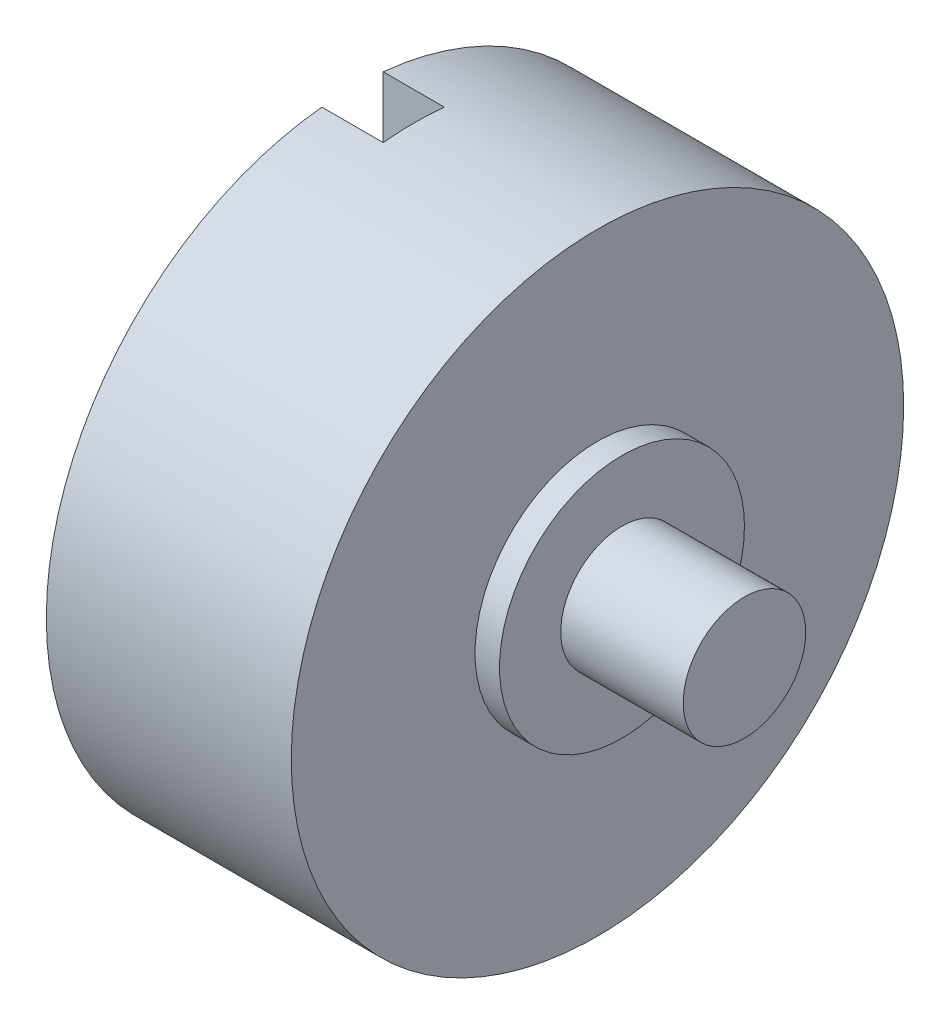
ISO-10303-21;
HEADER;
FILE_DESCRIPTION(('STEP AP214'),'2;1');
FILE_NAME('part.step','',(''),(''),'','','');
FILE_SCHEMA(('AUTOMOTIVE_DESIGN { 1 0 10303 214 1 1 1 1 }'));
ENDSEC;
DATA;
#1=APPLICATION_CONTEXT('core data for automotive mechanical design processes');
#2=APPLICATION_PROTOCOL_DEFINITION('international standard','automotive_design',2000,#1);
#3=PRODUCT_CONTEXT('',#1,'mechanical');
#4=PRODUCT('Part','Part','',(#3));
#5=PRODUCT_RELATED_PRODUCT_CATEGORY('part','',(#4));
#6=PRODUCT_DEFINITION_FORMATION('','',#4);
#7=PRODUCT_DEFINITION_CONTEXT('part definition',#1,'design');
#8=PRODUCT_DEFINITION('design','',#6,#7);
#9=PRODUCT_DEFINITION_SHAPE('','',#8);
#10=(LENGTH_UNIT() NAMED_UNIT(*) SI_UNIT(.MILLI.,.METRE.));
#11=(NAMED_UNIT(*) PLANE_ANGLE_UNIT() SI_UNIT($,.RADIAN.));
#12=(NAMED_UNIT(*) SI_UNIT($,.STERADIAN.) SOLID_ANGLE_UNIT());
#13=UNCERTAINTY_MEASURE_WITH_UNIT(LENGTH_MEASURE(1.E-05),#10,'distance_accuracy_value','');
#14=(GEOMETRIC_REPRESENTATION_CONTEXT(3) GLOBAL_UNCERTAINTY_ASSIGNED_CONTEXT((#13)) GLOBAL_UNIT_ASSIGNED_CONTEXT((#10,
#11,#12)) REPRESENTATION_CONTEXT('',''));
#15=CARTESIAN_POINT('',(0.,0.,0.));
#16=DIRECTION('',(0.,0.,1.));
#17=DIRECTION('',(1.,0.,0.));
#18=AXIS2_PLACEMENT_3D('',#15,#16,#17);
#19=CARTESIAN_POINT('',(10.,0.,0.));
#20=DIRECTION('',(1.,0.,0.));
#21=DIRECTION('',(0.,0.,-1.));
#22=AXIS2_PLACEMENT_3D('',#19,#20,#21);
#23=PLANE('',#22);
#24=CARTESIAN_POINT('',(10.,0.,0.));
#25=DIRECTION('',(1.,0.,0.));
#26=DIRECTION('',(0.,0.,-1.));
#27=AXIS2_PLACEMENT_3D('',#24,#25,#26);
#28=CIRCLE('',#27,25.);
#29=CARTESIAN_POINT('',(10.,0.,-25.));
#30=VERTEX_POINT('',#29);
#31=EDGE_CURVE('E11',#30,#30,#28,.T.);
#32=ORIENTED_EDGE('',*,*,#31,.T.);
#33=EDGE_LOOP('',(#32));
#34=FACE_BOUND('',#33,.T.);
#35=CARTESIAN_POINT('',(10.,0.,0.));
#36=DIRECTION('',(1.,0.,0.));
#37=DIRECTION('',(0.,0.,-1.));
#38=AXIS2_PLACEMENT_3D('',#35,#36,#37);
#39=CIRCLE('',#38,10.);
#40=CARTESIAN_POINT('',(10.,0.,-10.));
#41=VERTEX_POINT('',#40);
#42=EDGE_CURVE('E160',#41,#41,#39,.T.);
#43=ORIENTED_EDGE('',*,*,#42,.F.);
#44=EDGE_LOOP('',(#43));
#45=FACE_BOUND('',#44,.T.);
#46=ADVANCED_FACE('F35',(#34,#45),#23,.T.);
#47=CARTESIAN_POINT('',(-10.,0.,0.));
#48=DIRECTION('',(1.,0.,0.));
#49=DIRECTION('',(0.,0.,-1.));
#50=AXIS2_PLACEMENT_3D('',#47,#48,#49);
#51=PLANE('',#50);
#52=CARTESIAN_POINT('',(-10.,0.,0.));
#53=DIRECTION('',(1.,0.,0.));
#54=DIRECTION('',(0.,0.,-1.));
#55=AXIS2_PLACEMENT_3D('',#52,#53,#54);
#56=CIRCLE('',#55,25.);
#57=CARTESIAN_POINT('',(-10.,-24.8746859276655,-2.5));
#58=VERTEX_POINT('',#57);
#59=CARTESIAN_POINT('',(-10.,24.8746859276655,-2.5));
#60=VERTEX_POINT('',#59);
#61=EDGE_CURVE('E112',#58,#60,#56,.T.);
#62=ORIENTED_EDGE('',*,*,#61,.F.);
#63=DIRECTION('',(0.,-1.,0.));
#64=VECTOR('',#63,1.);
#65=CARTESIAN_POINT('',(-10.,24.8746859276655,-2.5));
#66=LINE('',#65,#64);
#67=EDGE_CURVE('E75',#60,#58,#66,.T.);
#68=ORIENTED_EDGE('',*,*,#67,.F.);
#69=EDGE_LOOP('',(#62,#68));
#70=FACE_BOUND('',#69,.T.);
#71=ADVANCED_FACE('F118',(#70),#51,.F.);
#72=CARTESIAN_POINT('',(10.,0.,0.));
#73=DIRECTION('',(-1.,0.,0.));
#74=DIRECTION('',(0.,0.,1.));
#75=AXIS2_PLACEMENT_3D('',#72,#73,#74);
#76=CYLINDRICAL_SURFACE('',#75,25.);
#77=ORIENTED_EDGE('',*,*,#61,.T.);
#78=DIRECTION('',(-1.,0.,0.));
#79=VECTOR('',#78,1.);
#80=CARTESIAN_POINT('',(-5.,24.8746859276655,-2.5));
#81=LINE('',#80,#79);
#82=CARTESIAN_POINT('',(-5.,24.8746859276655,-2.5));
#83=VERTEX_POINT('',#82);
#84=EDGE_CURVE('E89',#83,#60,#81,.T.);
#85=ORIENTED_EDGE('',*,*,#84,.F.);
#86=CARTESIAN_POINT('',(-5.,0.,0.));
#87=DIRECTION('',(-1.,0.,0.));
#88=DIRECTION('',(0.,0.,1.));
#89=AXIS2_PLACEMENT_3D('',#86,#87,#88);
#90=CIRCLE('',#89,25.);
#91=CARTESIAN_POINT('',(-5.,24.8746859276655,2.5));
#92=VERTEX_POINT('',#91);
#93=EDGE_CURVE('E93',#92,#83,#90,.T.);
#94=ORIENTED_EDGE('',*,*,#93,.F.);
#95=DIRECTION('',(-1.,0.,0.));
#96=VECTOR('',#95,1.);
#97=CARTESIAN_POINT('',(-5.,24.8746859276655,2.5));
#98=LINE('',#97,#96);
#99=CARTESIAN_POINT('',(-10.,24.8746859276655,2.5));
#100=VERTEX_POINT('',#99);
#101=EDGE_CURVE('E82',#92,#100,#98,.T.);
#102=ORIENTED_EDGE('',*,*,#101,.T.);
#103=CARTESIAN_POINT('',(-10.,-24.8746859276655,2.5));
#104=VERTEX_POINT('',#103);
#105=EDGE_CURVE('E44',#100,#104,#56,.T.);
#106=ORIENTED_EDGE('',*,*,#105,.T.);
#107=DIRECTION('',(-1.,0.,0.));
#108=VECTOR('',#107,1.);
#109=CARTESIAN_POINT('',(-5.,-24.8746859276655,2.5));
#110=LINE('',#109,#108);
#111=CARTESIAN_POINT('',(-5.,-24.8746859276655,2.5));
#112=VERTEX_POINT('',#111);
#113=EDGE_CURVE('E52',#112,#104,#110,.T.);
#114=ORIENTED_EDGE('',*,*,#113,.F.);
#115=CARTESIAN_POINT('',(-5.,0.,0.));
#116=DIRECTION('',(-1.,0.,0.));
#117=DIRECTION('',(0.,0.,1.));
#118=AXIS2_PLACEMENT_3D('',#115,#116,#117);
#119=CIRCLE('',#118,25.);
#120=CARTESIAN_POINT('',(-5.,-24.8746859276655,-2.5));
#121=VERTEX_POINT('',#120);
#122=EDGE_CURVE('E95',#121,#112,#119,.T.);
#123=ORIENTED_EDGE('',*,*,#122,.F.);
#124=DIRECTION('',(-1.,0.,0.));
#125=VECTOR('',#124,1.);
#126=CARTESIAN_POINT('',(-5.,-24.8746859276655,-2.5));
#127=LINE('',#126,#125);
#128=EDGE_CURVE('E61',#121,#58,#127,.T.);
#129=ORIENTED_EDGE('',*,*,#128,.T.);
#130=EDGE_LOOP('',(#77,#85,#94,#102,#106,#114,#123,#129));
#131=FACE_BOUND('',#130,.T.);
#132=ORIENTED_EDGE('',*,*,#31,.F.);
#133=EDGE_LOOP('',(#132));
#134=FACE_BOUND('',#133,.T.);
#135=ADVANCED_FACE('F37',(#131,#134),#76,.T.);
#136=ORIENTED_EDGE('',*,*,#105,.F.);
#137=DIRECTION('',(0.,1.,0.));
#138=VECTOR('',#137,1.);
#139=CARTESIAN_POINT('',(-10.,24.8746859276655,2.5));
#140=LINE('',#139,#138);
#141=EDGE_CURVE('E84',#104,#100,#140,.T.);
#142=ORIENTED_EDGE('',*,*,#141,.F.);
#143=EDGE_LOOP('',(#136,#142));
#144=FACE_BOUND('',#143,.T.);
#145=ADVANCED_FACE('F115',(#144),#51,.F.);
#146=CARTESIAN_POINT('',(-5.,24.8746859276655,-2.5));
#147=DIRECTION('',(0.,0.,-1.));
#148=DIRECTION('',(0.,1.,0.));
#149=AXIS2_PLACEMENT_3D('',#146,#147,#148);
#150=PLANE('',#149);
#151=ORIENTED_EDGE('',*,*,#67,.T.);
#152=ORIENTED_EDGE('',*,*,#128,.F.);
#153=DIRECTION('',(0.,-1.,0.));
#154=VECTOR('',#153,1.);
#155=CARTESIAN_POINT('',(-5.,24.8746859276655,-2.5));
#156=LINE('',#155,#154);
#157=EDGE_CURVE('E100',#83,#121,#156,.T.);
#158=ORIENTED_EDGE('',*,*,#157,.F.);
#159=ORIENTED_EDGE('',*,*,#84,.T.);
#160=EDGE_LOOP('',(#151,#152,#158,#159));
#161=FACE_BOUND('',#160,.T.);
#162=ADVANCED_FACE('F117',(#161),#150,.F.);
#163=CARTESIAN_POINT('',(-5.,24.8746859276655,2.5));
#164=DIRECTION('',(0.,0.,1.));
#165=DIRECTION('',(0.,-1.,0.));
#166=AXIS2_PLACEMENT_3D('',#163,#164,#165);
#167=PLANE('',#166);
#168=ORIENTED_EDGE('',*,*,#141,.T.);
#169=ORIENTED_EDGE('',*,*,#101,.F.);
#170=DIRECTION('',(0.,1.,0.));
#171=VECTOR('',#170,1.);
#172=CARTESIAN_POINT('',(-5.,24.8746859276655,2.5));
#173=LINE('',#172,#171);
#174=EDGE_CURVE('E79',#112,#92,#173,.T.);
#175=ORIENTED_EDGE('',*,*,#174,.F.);
#176=ORIENTED_EDGE('',*,*,#113,.T.);
#177=EDGE_LOOP('',(#168,#169,#175,#176));
#178=FACE_BOUND('',#177,.T.);
#179=ADVANCED_FACE('F83',(#178),#167,.F.);
#180=CARTESIAN_POINT('',(-5.,0.,0.));
#181=DIRECTION('',(-1.,0.,0.));
#182=DIRECTION('',(0.,0.,1.));
#183=AXIS2_PLACEMENT_3D('',#180,#181,#182);
#184=PLANE('',#183);
#185=ORIENTED_EDGE('',*,*,#122,.T.);
#186=ORIENTED_EDGE('',*,*,#174,.T.);
#187=ORIENTED_EDGE('',*,*,#93,.T.);
#188=ORIENTED_EDGE('',*,*,#157,.T.);
#189=EDGE_LOOP('',(#185,#186,#187,#188));
#190=FACE_BOUND('',#189,.T.);
#191=ADVANCED_FACE('F92',(#190),#184,.T.);
#192=CARTESIAN_POINT('',(12.,0.,0.));
#193=DIRECTION('',(1.,0.,0.));
#194=DIRECTION('',(0.,0.,-1.));
#195=AXIS2_PLACEMENT_3D('',#192,#193,#194);
#196=PLANE('',#195);
#197=CARTESIAN_POINT('',(12.,0.,0.));
#198=DIRECTION('',(1.,0.,0.));
#199=DIRECTION('',(0.,0.,-1.));
#200=AXIS2_PLACEMENT_3D('',#197,#198,#199);
#201=CIRCLE('',#200,10.);
#202=CARTESIAN_POINT('',(12.,0.,-10.));
#203=VERTEX_POINT('',#202);
#204=EDGE_CURVE('E157',#203,#203,#201,.T.);
#205=ORIENTED_EDGE('',*,*,#204,.T.);
#206=EDGE_LOOP('',(#205));
#207=FACE_BOUND('',#206,.T.);
#208=CARTESIAN_POINT('',(12.,0.,0.));
#209=DIRECTION('',(1.,0.,0.));
#210=DIRECTION('',(0.,0.,-1.));
#211=AXIS2_PLACEMENT_3D('',#208,#209,#210);
#212=CIRCLE('',#211,5.);
#213=CARTESIAN_POINT('',(12.,0.,-5.));
#214=VERTEX_POINT('',#213);
#215=EDGE_CURVE('E39',#214,#214,#212,.T.);
#216=ORIENTED_EDGE('',*,*,#215,.F.);
#217=EDGE_LOOP('',(#216));
#218=FACE_BOUND('',#217,.T.);
#219=ADVANCED_FACE('F146',(#207,#218),#196,.T.);
#220=CARTESIAN_POINT('',(12.,0.,0.));
#221=DIRECTION('',(-1.,0.,0.));
#222=DIRECTION('',(0.,0.,1.));
#223=AXIS2_PLACEMENT_3D('',#220,#221,#222);
#224=CYLINDRICAL_SURFACE('',#223,10.);
#225=ORIENTED_EDGE('',*,*,#204,.F.);
#226=EDGE_LOOP('',(#225));
#227=FACE_BOUND('',#226,.T.);
#228=ORIENTED_EDGE('',*,*,#42,.T.);
#229=EDGE_LOOP('',(#228));
#230=FACE_BOUND('',#229,.T.);
#231=ADVANCED_FACE('F140',(#227,#230),#224,.T.);
#232=CARTESIAN_POINT('',(22.,0.,0.));
#233=DIRECTION('',(1.,0.,0.));
#234=DIRECTION('',(0.,0.,-1.));
#235=AXIS2_PLACEMENT_3D('',#232,#233,#234);
#236=PLANE('',#235);
#237=CARTESIAN_POINT('',(22.,0.,0.));
#238=DIRECTION('',(1.,0.,0.));
#239=DIRECTION('',(0.,0.,-1.));
#240=AXIS2_PLACEMENT_3D('',#237,#238,#239);
#241=CIRCLE('',#240,5.);
#242=CARTESIAN_POINT('',(22.,0.,-5.));
#243=VERTEX_POINT('',#242);
#244=EDGE_CURVE('E108',#243,#243,#241,.T.);
#245=ORIENTED_EDGE('',*,*,#244,.T.);
#246=EDGE_LOOP('',(#245));
#247=FACE_BOUND('',#246,.T.);
#248=ADVANCED_FACE('F136',(#247),#236,.T.);
#249=CARTESIAN_POINT('',(22.,0.,0.));
#250=DIRECTION('',(-1.,0.,0.));
#251=DIRECTION('',(0.,0.,1.));
#252=AXIS2_PLACEMENT_3D('',#249,#250,#251);
#253=CYLINDRICAL_SURFACE('',#252,5.);
#254=ORIENTED_EDGE('',*,*,#215,.T.);
#255=EDGE_LOOP('',(#254));
#256=FACE_BOUND('',#255,.T.);
#257=ORIENTED_EDGE('',*,*,#244,.F.);
#258=EDGE_LOOP('',(#257));
#259=FACE_BOUND('',#258,.T.);
#260=ADVANCED_FACE('F133',(#256,#259),#253,.T.);
#261=CLOSED_SHELL('',(#46,#71,#135,#145,#162,#179,#191,#219,#231,#248,#260));
#262=MANIFOLD_SOLID_BREP('B2',#261);
#263=ADVANCED_BREP_SHAPE_REPRESENTATION('',(#18,#262),#14);
#264=SHAPE_DEFINITION_REPRESENTATION(#9,#263);
ENDSEC;
END-ISO-10303-21;
